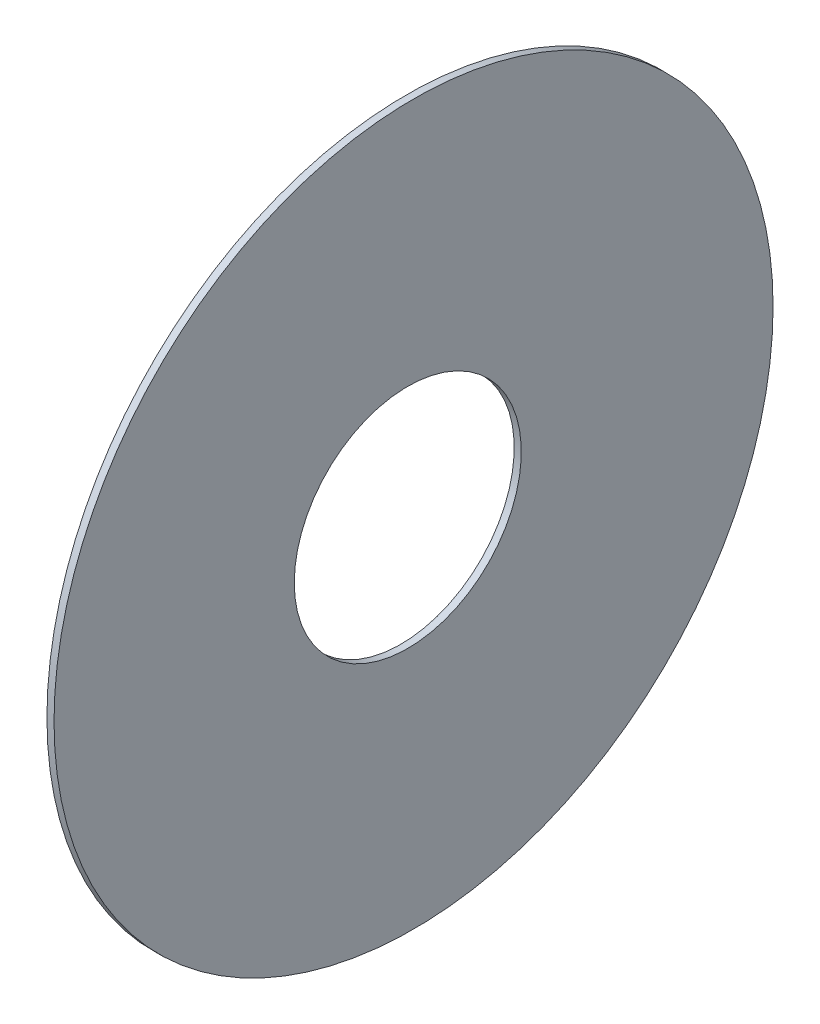
ISO-10303-21;
HEADER;
FILE_DESCRIPTION(('STEP AP214'),'2;1');
FILE_NAME('part.step','',(''),(''),'','','');
FILE_SCHEMA(('AUTOMOTIVE_DESIGN { 1 0 10303 214 1 1 1 1 }'));
ENDSEC;
DATA;
#1=APPLICATION_CONTEXT('core data for automotive mechanical design processes');
#2=APPLICATION_PROTOCOL_DEFINITION('international standard','automotive_design',2000,#1);
#3=PRODUCT_CONTEXT('',#1,'mechanical');
#4=PRODUCT('Part','Part','',(#3));
#5=PRODUCT_RELATED_PRODUCT_CATEGORY('part','',(#4));
#6=PRODUCT_DEFINITION_FORMATION('','',#4);
#7=PRODUCT_DEFINITION_CONTEXT('part definition',#1,'design');
#8=PRODUCT_DEFINITION('design','',#6,#7);
#9=PRODUCT_DEFINITION_SHAPE('','',#8);
#10=(LENGTH_UNIT() NAMED_UNIT(*) SI_UNIT(.MILLI.,.METRE.));
#11=(NAMED_UNIT(*) PLANE_ANGLE_UNIT() SI_UNIT($,.RADIAN.));
#12=(NAMED_UNIT(*) SI_UNIT($,.STERADIAN.) SOLID_ANGLE_UNIT());
#13=UNCERTAINTY_MEASURE_WITH_UNIT(LENGTH_MEASURE(1.E-05),#10,'distance_accuracy_value','');
#14=(GEOMETRIC_REPRESENTATION_CONTEXT(3) GLOBAL_UNCERTAINTY_ASSIGNED_CONTEXT((#13)) GLOBAL_UNIT_ASSIGNED_CONTEXT((#10,
#11,#12)) REPRESENTATION_CONTEXT('',''));
#15=CARTESIAN_POINT('',(0.,0.,0.));
#16=DIRECTION('',(0.,0.,1.));
#17=DIRECTION('',(1.,0.,0.));
#18=AXIS2_PLACEMENT_3D('',#15,#16,#17);
#19=CARTESIAN_POINT('',(4.7625,0.,-3.86982290650531));
#20=DIRECTION('',(1.,0.,0.));
#21=DIRECTION('',(0.,0.,-1.));
#22=AXIS2_PLACEMENT_3D('',#19,#20,#21);
#23=PLANE('',#22);
#24=CARTESIAN_POINT('',(4.7625,0.,-3.86982290650531));
#25=DIRECTION('',(1.,0.,0.));
#26=DIRECTION('',(0.,0.,-1.));
#27=AXIS2_PLACEMENT_3D('',#24,#25,#26);
#28=CIRCLE('',#27,241.3);
#29=CARTESIAN_POINT('',(4.7625,0.,237.430177093495));
#30=VERTEX_POINT('',#29);
#31=EDGE_CURVE('E10',#30,#30,#28,.T.);
#32=ORIENTED_EDGE('',*,*,#31,.T.);
#33=EDGE_LOOP('',(#32));
#34=FACE_BOUND('',#33,.T.);
#35=CARTESIAN_POINT('',(4.7625,0.,0.));
#36=DIRECTION('',(1.,0.,0.));
#37=DIRECTION('',(0.,0.,-1.));
#38=AXIS2_PLACEMENT_3D('',#35,#36,#37);
#39=CIRCLE('',#38,76.2);
#40=CARTESIAN_POINT('',(4.7625,0.,76.2));
#41=VERTEX_POINT('',#40);
#42=EDGE_CURVE('E46',#41,#41,#39,.T.);
#43=ORIENTED_EDGE('',*,*,#42,.F.);
#44=EDGE_LOOP('',(#43));
#45=FACE_BOUND('',#44,.T.);
#46=ADVANCED_FACE('F35',(#34,#45),#23,.T.);
#47=CARTESIAN_POINT('',(0.,0.,-3.86982290650531));
#48=DIRECTION('',(1.,0.,0.));
#49=DIRECTION('',(0.,0.,-1.));
#50=AXIS2_PLACEMENT_3D('',#47,#48,#49);
#51=PLANE('',#50);
#52=CARTESIAN_POINT('',(0.,0.,-3.86982290650531));
#53=DIRECTION('',(1.,0.,0.));
#54=DIRECTION('',(0.,0.,-1.));
#55=AXIS2_PLACEMENT_3D('',#52,#53,#54);
#56=CIRCLE('',#55,241.3);
#57=CARTESIAN_POINT('',(0.,0.,237.430177093495));
#58=VERTEX_POINT('',#57);
#59=EDGE_CURVE('E39',#58,#58,#56,.T.);
#60=ORIENTED_EDGE('',*,*,#59,.F.);
#61=EDGE_LOOP('',(#60));
#62=FACE_BOUND('',#61,.T.);
#63=CARTESIAN_POINT('',(0.,0.,0.));
#64=DIRECTION('',(1.,0.,0.));
#65=DIRECTION('',(0.,0.,-1.));
#66=AXIS2_PLACEMENT_3D('',#63,#64,#65);
#67=CIRCLE('',#66,76.2);
#68=CARTESIAN_POINT('',(0.,0.,76.2));
#69=VERTEX_POINT('',#68);
#70=EDGE_CURVE('E48',#69,#69,#67,.T.);
#71=ORIENTED_EDGE('',*,*,#70,.T.);
#72=EDGE_LOOP('',(#71));
#73=FACE_BOUND('',#72,.T.);
#74=ADVANCED_FACE('F58',(#62,#73),#51,.F.);
#75=CARTESIAN_POINT('',(4.7625,0.,-3.86982290650531));
#76=DIRECTION('',(-1.,0.,0.));
#77=DIRECTION('',(0.,0.,1.));
#78=AXIS2_PLACEMENT_3D('',#75,#76,#77);
#79=CYLINDRICAL_SURFACE('',#78,241.3);
#80=CARTESIAN_POINT('',(4.7625,0.,237.430177093495));
#81=CARTESIAN_POINT('',(4.712890625,0.,237.430177093495));
#82=CARTESIAN_POINT('',(4.66328125,0.,237.430177093495));
#83=CARTESIAN_POINT('',(4.5640625,0.,237.430177093495));
#84=CARTESIAN_POINT('',(4.514453125,0.,237.430177093495));
#85=CARTESIAN_POINT('',(4.415234375,0.,237.430177093495));
#86=CARTESIAN_POINT('',(4.365625,0.,237.430177093495));
#87=CARTESIAN_POINT('',(4.26640625,0.,237.430177093495));
#88=CARTESIAN_POINT('',(4.216796875,0.,237.430177093495));
#89=CARTESIAN_POINT('',(4.117578125,0.,237.430177093495));
#90=CARTESIAN_POINT('',(4.06796875,0.,237.430177093495));
#91=CARTESIAN_POINT('',(3.96875,0.,237.430177093495));
#92=CARTESIAN_POINT('',(3.919140625,0.,237.430177093495));
#93=CARTESIAN_POINT('',(3.819921875,0.,237.430177093495));
#94=CARTESIAN_POINT('',(3.7703125,0.,237.430177093495));
#95=CARTESIAN_POINT('',(3.67109375,0.,237.430177093495));
#96=CARTESIAN_POINT('',(3.621484375,0.,237.430177093495));
#97=CARTESIAN_POINT('',(3.522265625,0.,237.430177093495));
#98=CARTESIAN_POINT('',(3.47265625,0.,237.430177093495));
#99=CARTESIAN_POINT('',(3.3734375,0.,237.430177093495));
#100=CARTESIAN_POINT('',(3.323828125,0.,237.430177093495));
#101=CARTESIAN_POINT('',(3.224609375,0.,237.430177093495));
#102=CARTESIAN_POINT('',(3.175,0.,237.430177093495));
#103=CARTESIAN_POINT('',(3.07578125,0.,237.430177093495));
#104=CARTESIAN_POINT('',(3.026171875,0.,237.430177093495));
#105=CARTESIAN_POINT('',(2.926953125,0.,237.430177093495));
#106=CARTESIAN_POINT('',(2.87734375,0.,237.430177093495));
#107=CARTESIAN_POINT('',(2.778125,0.,237.430177093495));
#108=CARTESIAN_POINT('',(2.728515625,0.,237.430177093495));
#109=CARTESIAN_POINT('',(2.629296875,0.,237.430177093495));
#110=CARTESIAN_POINT('',(2.5796875,0.,237.430177093495));
#111=CARTESIAN_POINT('',(2.48046875,0.,237.430177093495));
#112=CARTESIAN_POINT('',(2.430859375,0.,237.430177093495));
#113=CARTESIAN_POINT('',(2.331640625,0.,237.430177093495));
#114=CARTESIAN_POINT('',(2.28203125,0.,237.430177093495));
#115=CARTESIAN_POINT('',(2.1828125,0.,237.430177093495));
#116=CARTESIAN_POINT('',(2.133203125,0.,237.430177093495));
#117=CARTESIAN_POINT('',(2.033984375,0.,237.430177093495));
#118=CARTESIAN_POINT('',(1.984375,0.,237.430177093495));
#119=CARTESIAN_POINT('',(1.88515625,0.,237.430177093495));
#120=CARTESIAN_POINT('',(1.835546875,0.,237.430177093495));
#121=CARTESIAN_POINT('',(1.736328125,0.,237.430177093495));
#122=CARTESIAN_POINT('',(1.68671875,0.,237.430177093495));
#123=CARTESIAN_POINT('',(1.5875,0.,237.430177093495));
#124=CARTESIAN_POINT('',(1.537890625,0.,237.430177093495));
#125=CARTESIAN_POINT('',(1.438671875,0.,237.430177093495));
#126=CARTESIAN_POINT('',(1.3890625,0.,237.430177093495));
#127=CARTESIAN_POINT('',(1.28984375,0.,237.430177093495));
#128=CARTESIAN_POINT('',(1.240234375,0.,237.430177093495));
#129=CARTESIAN_POINT('',(1.141015625,0.,237.430177093495));
#130=CARTESIAN_POINT('',(1.09140625,0.,237.430177093495));
#131=CARTESIAN_POINT('',(0.9921875,0.,237.430177093495));
#132=CARTESIAN_POINT('',(0.942578125,0.,237.430177093495));
#133=CARTESIAN_POINT('',(0.843359375,0.,237.430177093495));
#134=CARTESIAN_POINT('',(0.79375,0.,237.430177093495));
#135=CARTESIAN_POINT('',(0.69453125,0.,237.430177093495));
#136=CARTESIAN_POINT('',(0.644921875,0.,237.430177093495));
#137=CARTESIAN_POINT('',(0.545703125,0.,237.430177093495));
#138=CARTESIAN_POINT('',(0.49609375,0.,237.430177093495));
#139=CARTESIAN_POINT('',(0.396875,0.,237.430177093495));
#140=CARTESIAN_POINT('',(0.347265625,0.,237.430177093495));
#141=CARTESIAN_POINT('',(0.248046875,0.,237.430177093495));
#142=CARTESIAN_POINT('',(0.1984375,0.,237.430177093495));
#143=CARTESIAN_POINT('',(0.09921875,0.,237.430177093495));
#144=CARTESIAN_POINT('',(0.049609375,0.,237.430177093495));
#145=CARTESIAN_POINT('',(0.,0.,237.430177093495));
#146=B_SPLINE_CURVE_WITH_KNOTS('',3,(#80,#81,#82,#83,#84,#85,#86,#87,#88,#89,#90,#91,#92,#93,
#94,#95,#96,#97,#98,#99,#100,#101,#102,#103,#104,#105,#106,#107,#108,#109,#110,#111,#112,#113,
#114,#115,#116,#117,#118,#119,#120,#121,#122,#123,#124,#125,#126,#127,#128,#129,#130,#131,#132,
#133,#134,#135,#136,#137,#138,#139,#140,#141,#142,#143,#144,#145),.UNSPECIFIED.,.F.,.F.,(4,2,2,
2,2,2,2,2,2,2,2,2,2,2,2,2,2,2,2,2,2,2,2,2,2,2,2,2,2,2,2,2,4),(0.,0.148828124999999,
0.297656249999999,0.446484374999999,0.595312499999999,0.744140625,0.89296875,1.041796875,
1.190625,1.339453125,1.48828125,1.637109375,1.7859375,1.934765625,2.08359375,2.232421875,
2.38125,2.530078125,2.67890625,2.827734375,2.9765625,3.125390625,3.27421875,3.423046875,
3.571875,3.720703125,3.86953125,4.018359375,4.1671875,4.316015625,4.46484375,4.613671875,
4.7625),.UNSPECIFIED.);
#147=EDGE_CURVE('BSEAM37',#30,#58,#146,.T.);
#148=ORIENTED_EDGE('',*,*,#31,.F.);
#149=ORIENTED_EDGE('',*,*,#59,.T.);
#150=ORIENTED_EDGE('',*,*,#147,.T.);
#151=ORIENTED_EDGE('',*,*,#147,.F.);
#152=EDGE_LOOP('',(#148,#150,#149,#151));
#153=FACE_BOUND('',#152,.T.);
#154=ADVANCED_FACE('F37',(#153),#79,.T.);
#155=CARTESIAN_POINT('',(4.7625,0.,0.));
#156=DIRECTION('',(-1.,0.,0.));
#157=DIRECTION('',(0.,0.,1.));
#158=AXIS2_PLACEMENT_3D('',#155,#156,#157);
#159=CYLINDRICAL_SURFACE('',#158,76.2);
#160=CARTESIAN_POINT('',(4.7625,0.,76.2));
#161=CARTESIAN_POINT('',(4.712890625,0.,76.2));
#162=CARTESIAN_POINT('',(4.66328125,0.,76.2));
#163=CARTESIAN_POINT('',(4.5640625,0.,76.2));
#164=CARTESIAN_POINT('',(4.514453125,0.,76.2));
#165=CARTESIAN_POINT('',(4.415234375,0.,76.2));
#166=CARTESIAN_POINT('',(4.365625,0.,76.2));
#167=CARTESIAN_POINT('',(4.26640625,0.,76.2));
#168=CARTESIAN_POINT('',(4.216796875,0.,76.2));
#169=CARTESIAN_POINT('',(4.117578125,0.,76.2));
#170=CARTESIAN_POINT('',(4.06796875,0.,76.2));
#171=CARTESIAN_POINT('',(3.96875,0.,76.2));
#172=CARTESIAN_POINT('',(3.919140625,0.,76.2));
#173=CARTESIAN_POINT('',(3.819921875,0.,76.2));
#174=CARTESIAN_POINT('',(3.7703125,0.,76.2));
#175=CARTESIAN_POINT('',(3.67109375,0.,76.2));
#176=CARTESIAN_POINT('',(3.621484375,0.,76.2));
#177=CARTESIAN_POINT('',(3.522265625,0.,76.2));
#178=CARTESIAN_POINT('',(3.47265625,0.,76.2));
#179=CARTESIAN_POINT('',(3.3734375,0.,76.2));
#180=CARTESIAN_POINT('',(3.323828125,0.,76.2));
#181=CARTESIAN_POINT('',(3.224609375,0.,76.2));
#182=CARTESIAN_POINT('',(3.175,0.,76.2));
#183=CARTESIAN_POINT('',(3.07578125,0.,76.2));
#184=CARTESIAN_POINT('',(3.026171875,0.,76.2));
#185=CARTESIAN_POINT('',(2.926953125,0.,76.2));
#186=CARTESIAN_POINT('',(2.87734375,0.,76.2));
#187=CARTESIAN_POINT('',(2.778125,0.,76.2));
#188=CARTESIAN_POINT('',(2.728515625,0.,76.2));
#189=CARTESIAN_POINT('',(2.629296875,0.,76.2));
#190=CARTESIAN_POINT('',(2.5796875,0.,76.2));
#191=CARTESIAN_POINT('',(2.48046875,0.,76.2));
#192=CARTESIAN_POINT('',(2.430859375,0.,76.2));
#193=CARTESIAN_POINT('',(2.331640625,0.,76.2));
#194=CARTESIAN_POINT('',(2.28203125,0.,76.2));
#195=CARTESIAN_POINT('',(2.1828125,0.,76.2));
#196=CARTESIAN_POINT('',(2.133203125,0.,76.2));
#197=CARTESIAN_POINT('',(2.033984375,0.,76.2));
#198=CARTESIAN_POINT('',(1.984375,0.,76.2));
#199=CARTESIAN_POINT('',(1.88515625,0.,76.2));
#200=CARTESIAN_POINT('',(1.835546875,0.,76.2));
#201=CARTESIAN_POINT('',(1.736328125,0.,76.2));
#202=CARTESIAN_POINT('',(1.68671875,0.,76.2));
#203=CARTESIAN_POINT('',(1.5875,0.,76.2));
#204=CARTESIAN_POINT('',(1.537890625,0.,76.2));
#205=CARTESIAN_POINT('',(1.438671875,0.,76.2));
#206=CARTESIAN_POINT('',(1.3890625,0.,76.2));
#207=CARTESIAN_POINT('',(1.28984375,0.,76.2));
#208=CARTESIAN_POINT('',(1.240234375,0.,76.2));
#209=CARTESIAN_POINT('',(1.141015625,0.,76.2));
#210=CARTESIAN_POINT('',(1.09140625,0.,76.2));
#211=CARTESIAN_POINT('',(0.9921875,0.,76.2));
#212=CARTESIAN_POINT('',(0.942578125,0.,76.2));
#213=CARTESIAN_POINT('',(0.843359375,0.,76.2));
#214=CARTESIAN_POINT('',(0.79375,0.,76.2));
#215=CARTESIAN_POINT('',(0.69453125,0.,76.2));
#216=CARTESIAN_POINT('',(0.644921875,0.,76.2));
#217=CARTESIAN_POINT('',(0.545703125,0.,76.2));
#218=CARTESIAN_POINT('',(0.49609375,0.,76.2));
#219=CARTESIAN_POINT('',(0.396875,0.,76.2));
#220=CARTESIAN_POINT('',(0.347265625,0.,76.2));
#221=CARTESIAN_POINT('',(0.248046875,0.,76.2));
#222=CARTESIAN_POINT('',(0.1984375,0.,76.2));
#223=CARTESIAN_POINT('',(0.09921875,0.,76.2));
#224=CARTESIAN_POINT('',(0.049609375,0.,76.2));
#225=CARTESIAN_POINT('',(0.,0.,76.2));
#226=B_SPLINE_CURVE_WITH_KNOTS('',3,(#160,#161,#162,#163,#164,#165,#166,#167,#168,#169,#170,
#171,#172,#173,#174,#175,#176,#177,#178,#179,#180,#181,#182,#183,#184,#185,#186,#187,#188,#189,
#190,#191,#192,#193,#194,#195,#196,#197,#198,#199,#200,#201,#202,#203,#204,#205,#206,#207,#208,
#209,#210,#211,#212,#213,#214,#215,#216,#217,#218,#219,#220,#221,#222,#223,#224,#225),
.UNSPECIFIED.,.F.,.F.,(4,2,2,2,2,2,2,2,2,2,2,2,2,2,2,2,2,2,2,2,2,2,2,2,2,2,2,2,2,2,2,2,4),(0.,
0.148828124999999,0.297656249999999,0.446484374999999,0.595312499999999,0.744140625,0.89296875,
1.041796875,1.190625,1.339453125,1.48828125,1.637109375,1.7859375,1.934765625,2.08359375,
2.232421875,2.38125,2.530078125,2.67890625,2.827734375,2.9765625,3.125390625,3.27421875,
3.423046875,3.571875,3.720703125,3.86953125,4.018359375,4.1671875,4.316015625,4.46484375,
4.613671875,4.7625),.UNSPECIFIED.);
#227=EDGE_CURVE('BSEAM54',#41,#69,#226,.T.);
#228=ORIENTED_EDGE('',*,*,#42,.T.);
#229=ORIENTED_EDGE('',*,*,#70,.F.);
#230=ORIENTED_EDGE('',*,*,#227,.T.);
#231=ORIENTED_EDGE('',*,*,#227,.F.);
#232=EDGE_LOOP('',(#228,#230,#229,#231));
#233=FACE_BOUND('',#232,.T.);
#234=ADVANCED_FACE('F54',(#233),#159,.F.);
#235=CLOSED_SHELL('',(#46,#74,#154,#234));
#236=MANIFOLD_SOLID_BREP('B2',#235);
#237=ADVANCED_BREP_SHAPE_REPRESENTATION('',(#18,#236),#14);
#238=SHAPE_DEFINITION_REPRESENTATION(#9,#237);
ENDSEC;
END-ISO-10303-21;
